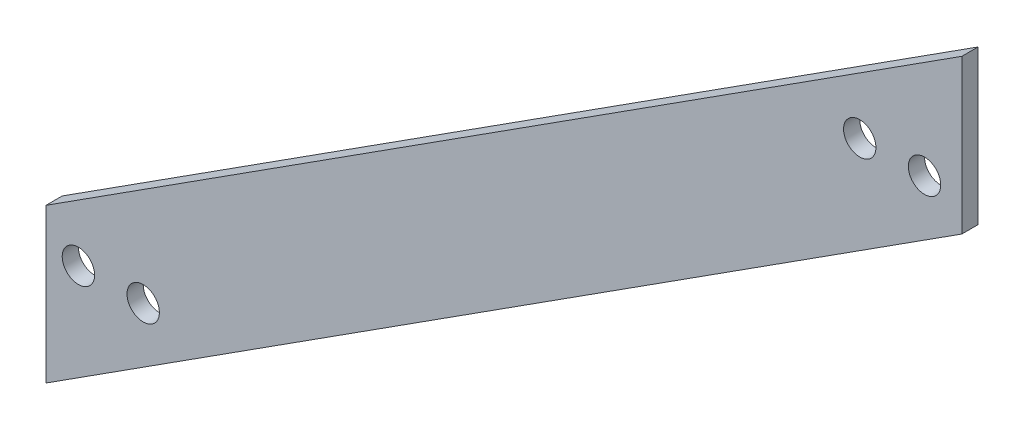
ISO-10303-21;
HEADER;
FILE_DESCRIPTION(('STEP AP214'),'2;1');
FILE_NAME('part.step','',(''),(''),'','','');
FILE_SCHEMA(('AUTOMOTIVE_DESIGN { 1 0 10303 214 1 1 1 1 }'));
ENDSEC;
DATA;
#1=APPLICATION_CONTEXT('core data for automotive mechanical design processes');
#2=APPLICATION_PROTOCOL_DEFINITION('international standard','automotive_design',2000,#1);
#3=PRODUCT_CONTEXT('',#1,'mechanical');
#4=PRODUCT('Part','Part','',(#3));
#5=PRODUCT_RELATED_PRODUCT_CATEGORY('part','',(#4));
#6=PRODUCT_DEFINITION_FORMATION('','',#4);
#7=PRODUCT_DEFINITION_CONTEXT('part definition',#1,'design');
#8=PRODUCT_DEFINITION('design','',#6,#7);
#9=PRODUCT_DEFINITION_SHAPE('','',#8);
#10=(LENGTH_UNIT() NAMED_UNIT(*) SI_UNIT(.MILLI.,.METRE.));
#11=(NAMED_UNIT(*) PLANE_ANGLE_UNIT() SI_UNIT($,.RADIAN.));
#12=(NAMED_UNIT(*) SI_UNIT($,.STERADIAN.) SOLID_ANGLE_UNIT());
#13=UNCERTAINTY_MEASURE_WITH_UNIT(LENGTH_MEASURE(1.E-05),#10,'distance_accuracy_value','');
#14=(GEOMETRIC_REPRESENTATION_CONTEXT(3) GLOBAL_UNCERTAINTY_ASSIGNED_CONTEXT((#13)) GLOBAL_UNIT_ASSIGNED_CONTEXT((#10,
#11,#12)) REPRESENTATION_CONTEXT('',''));
#15=CARTESIAN_POINT('',(0.,0.,0.));
#16=DIRECTION('',(0.,0.,1.));
#17=DIRECTION('',(1.,0.,0.));
#18=AXIS2_PLACEMENT_3D('',#15,#16,#17);
#19=CARTESIAN_POINT('',(0.,0.,4.7625));
#20=DIRECTION('',(0.,0.,1.));
#21=DIRECTION('',(1.,0.,0.));
#22=AXIS2_PLACEMENT_3D('',#19,#20,#21);
#23=PLANE('',#22);
#24=CARTESIAN_POINT('',(239.234787133526,136.66818134882,4.7625));
#25=DIRECTION('',(0.,0.,1.));
#26=DIRECTION('',(1.,0.,0.));
#27=AXIS2_PLACEMENT_3D('',#24,#25,#26);
#28=CIRCLE('',#27,4.76250000000001);
#29=CARTESIAN_POINT('',(234.472287133526,136.66818134882,4.7625));
#30=VERTEX_POINT('',#29);
#31=EDGE_CURVE('E129',#30,#30,#28,.T.);
#32=ORIENTED_EDGE('',*,*,#31,.F.);
#33=EDGE_LOOP('',(#32));
#34=FACE_BOUND('',#33,.T.);
#35=CARTESIAN_POINT('',(9.525,-10.6518186511802,4.7625));
#36=DIRECTION('',(0.,0.,1.));
#37=DIRECTION('',(1.,0.,0.));
#38=AXIS2_PLACEMENT_3D('',#35,#36,#37);
#39=CIRCLE('',#38,4.76250000000001);
#40=CARTESIAN_POINT('',(4.76249999999999,-10.6518186511802,4.7625));
#41=VERTEX_POINT('',#40);
#42=EDGE_CURVE('E108',#41,#41,#39,.T.);
#43=ORIENTED_EDGE('',*,*,#42,.F.);
#44=EDGE_LOOP('',(#43));
#45=FACE_BOUND('',#44,.T.);
#46=DIRECTION('',(-0.841938046068308,-0.53957420859663,0.));
#47=VECTOR('',#46,1.);
#48=CARTESIAN_POINT('',(269.24,172.548277870282,4.7625));
#49=LINE('',#48,#47);
#50=CARTESIAN_POINT('',(269.24,172.548277870282,4.7625));
#51=VERTEX_POINT('',#50);
#52=CARTESIAN_POINT('',(0.,0.,4.7625));
#53=VERTEX_POINT('',#52);
#54=EDGE_CURVE('E93',#51,#53,#49,.T.);
#55=ORIENTED_EDGE('',*,*,#54,.T.);
#56=DIRECTION('',(0.,-1.,0.));
#57=VECTOR('',#56,1.);
#58=CARTESIAN_POINT('',(0.,0.,4.7625));
#59=LINE('',#58,#57);
#60=CARTESIAN_POINT('',(0.,-45.2527358490541,4.7625));
#61=VERTEX_POINT('',#60);
#62=EDGE_CURVE('E88',#53,#61,#59,.T.);
#63=ORIENTED_EDGE('',*,*,#62,.T.);
#64=DIRECTION('',(0.841938046068308,0.539574208596631,0.));
#65=VECTOR('',#64,1.);
#66=CARTESIAN_POINT('',(0.,-45.2527358490541,4.7625));
#67=LINE('',#66,#65);
#68=CARTESIAN_POINT('',(269.24,127.295542021228,4.7625));
#69=VERTEX_POINT('',#68);
#70=EDGE_CURVE('E91',#61,#69,#67,.T.);
#71=ORIENTED_EDGE('',*,*,#70,.T.);
#72=DIRECTION('',(0.,1.,0.));
#73=VECTOR('',#72,1.);
#74=CARTESIAN_POINT('',(269.24,127.295542021228,4.7625));
#75=LINE('',#74,#73);
#76=EDGE_CURVE('E58',#69,#51,#75,.T.);
#77=ORIENTED_EDGE('',*,*,#76,.T.);
#78=EDGE_LOOP('',(#55,#63,#71,#77));
#79=FACE_BOUND('',#78,.T.);
#80=CARTESIAN_POINT('',(28.575,-10.6518186511802,4.7625));
#81=DIRECTION('',(0.,0.,1.));
#82=DIRECTION('',(1.,0.,0.));
#83=AXIS2_PLACEMENT_3D('',#80,#81,#82);
#84=CIRCLE('',#83,4.76250000000001);
#85=CARTESIAN_POINT('',(23.8125,-10.6518186511802,4.7625));
#86=VERTEX_POINT('',#85);
#87=EDGE_CURVE('E123',#86,#86,#84,.T.);
#88=ORIENTED_EDGE('',*,*,#87,.F.);
#89=EDGE_LOOP('',(#88));
#90=FACE_BOUND('',#89,.T.);
#91=CARTESIAN_POINT('',(258.284787133526,136.66818134882,4.7625));
#92=DIRECTION('',(0.,0.,1.));
#93=DIRECTION('',(1.,0.,0.));
#94=AXIS2_PLACEMENT_3D('',#91,#92,#93);
#95=CIRCLE('',#94,4.76250000000001);
#96=CARTESIAN_POINT('',(253.522287133526,136.66818134882,4.7625));
#97=VERTEX_POINT('',#96);
#98=EDGE_CURVE('E135',#97,#97,#95,.T.);
#99=ORIENTED_EDGE('',*,*,#98,.F.);
#100=EDGE_LOOP('',(#99));
#101=FACE_BOUND('',#100,.T.);
#102=ADVANCED_FACE('F41',(#34,#45,#79,#90,#101),#23,.T.);
#103=CARTESIAN_POINT('',(0.,0.,0.));
#104=DIRECTION('',(0.,0.,1.));
#105=DIRECTION('',(1.,0.,0.));
#106=AXIS2_PLACEMENT_3D('',#103,#104,#105);
#107=PLANE('',#106);
#108=DIRECTION('',(-0.841938046068308,-0.53957420859663,0.));
#109=VECTOR('',#108,1.);
#110=CARTESIAN_POINT('',(269.24,172.548277870282,0.));
#111=LINE('',#110,#109);
#112=CARTESIAN_POINT('',(269.24,172.548277870282,0.));
#113=VERTEX_POINT('',#112);
#114=CARTESIAN_POINT('',(0.,0.,0.));
#115=VERTEX_POINT('',#114);
#116=EDGE_CURVE('E105',#113,#115,#111,.T.);
#117=ORIENTED_EDGE('',*,*,#116,.F.);
#118=DIRECTION('',(0.,1.,0.));
#119=VECTOR('',#118,1.);
#120=CARTESIAN_POINT('',(269.24,127.295542021228,0.));
#121=LINE('',#120,#119);
#122=CARTESIAN_POINT('',(269.24,127.295542021228,0.));
#123=VERTEX_POINT('',#122);
#124=EDGE_CURVE('E81',#123,#113,#121,.T.);
#125=ORIENTED_EDGE('',*,*,#124,.F.);
#126=DIRECTION('',(0.841938046068308,0.539574208596631,0.));
#127=VECTOR('',#126,1.);
#128=CARTESIAN_POINT('',(0.,-45.2527358490541,0.));
#129=LINE('',#128,#127);
#130=CARTESIAN_POINT('',(0.,-45.2527358490541,0.));
#131=VERTEX_POINT('',#130);
#132=EDGE_CURVE('E75',#131,#123,#129,.T.);
#133=ORIENTED_EDGE('',*,*,#132,.F.);
#134=DIRECTION('',(0.,-1.,0.));
#135=VECTOR('',#134,1.);
#136=CARTESIAN_POINT('',(0.,0.,0.));
#137=LINE('',#136,#135);
#138=EDGE_CURVE('E97',#115,#131,#137,.T.);
#139=ORIENTED_EDGE('',*,*,#138,.F.);
#140=EDGE_LOOP('',(#117,#125,#133,#139));
#141=FACE_BOUND('',#140,.T.);
#142=CARTESIAN_POINT('',(9.525,-10.6518186511802,0.));
#143=DIRECTION('',(0.,0.,1.));
#144=DIRECTION('',(1.,0.,0.));
#145=AXIS2_PLACEMENT_3D('',#142,#143,#144);
#146=CIRCLE('',#145,4.76250000000001);
#147=CARTESIAN_POINT('',(4.76249999999999,-10.6518186511802,0.));
#148=VERTEX_POINT('',#147);
#149=EDGE_CURVE('E120',#148,#148,#146,.T.);
#150=ORIENTED_EDGE('',*,*,#149,.T.);
#151=EDGE_LOOP('',(#150));
#152=FACE_BOUND('',#151,.T.);
#153=CARTESIAN_POINT('',(28.575,-10.6518186511802,0.));
#154=DIRECTION('',(0.,0.,1.));
#155=DIRECTION('',(1.,0.,0.));
#156=AXIS2_PLACEMENT_3D('',#153,#154,#155);
#157=CIRCLE('',#156,4.76250000000001);
#158=CARTESIAN_POINT('',(23.8125,-10.6518186511802,0.));
#159=VERTEX_POINT('',#158);
#160=EDGE_CURVE('E126',#159,#159,#157,.T.);
#161=ORIENTED_EDGE('',*,*,#160,.T.);
#162=EDGE_LOOP('',(#161));
#163=FACE_BOUND('',#162,.T.);
#164=CARTESIAN_POINT('',(239.234787133526,136.66818134882,0.));
#165=DIRECTION('',(0.,0.,1.));
#166=DIRECTION('',(1.,0.,0.));
#167=AXIS2_PLACEMENT_3D('',#164,#165,#166);
#168=CIRCLE('',#167,4.76250000000001);
#169=CARTESIAN_POINT('',(234.472287133526,136.66818134882,0.));
#170=VERTEX_POINT('',#169);
#171=EDGE_CURVE('E132',#170,#170,#168,.T.);
#172=ORIENTED_EDGE('',*,*,#171,.T.);
#173=EDGE_LOOP('',(#172));
#174=FACE_BOUND('',#173,.T.);
#175=CARTESIAN_POINT('',(258.284787133526,136.66818134882,0.));
#176=DIRECTION('',(0.,0.,1.));
#177=DIRECTION('',(1.,0.,0.));
#178=AXIS2_PLACEMENT_3D('',#175,#176,#177);
#179=CIRCLE('',#178,4.76250000000001);
#180=CARTESIAN_POINT('',(253.522287133526,136.66818134882,0.));
#181=VERTEX_POINT('',#180);
#182=EDGE_CURVE('E138',#181,#181,#179,.T.);
#183=ORIENTED_EDGE('',*,*,#182,.T.);
#184=EDGE_LOOP('',(#183));
#185=FACE_BOUND('',#184,.T.);
#186=ADVANCED_FACE('F116',(#141,#152,#163,#174,#185),#107,.F.);
#187=CARTESIAN_POINT('',(269.24,172.548277870282,4.7625));
#188=DIRECTION('',(0.53957420859663,-0.841938046068308,0.));
#189=DIRECTION('',(0.841938046068308,0.53957420859663,0.));
#190=AXIS2_PLACEMENT_3D('',#187,#188,#189);
#191=PLANE('',#190);
#192=ORIENTED_EDGE('',*,*,#116,.T.);
#193=DIRECTION('',(0.,0.,-1.));
#194=VECTOR('',#193,1.);
#195=CARTESIAN_POINT('',(0.,0.,4.7625));
#196=LINE('',#195,#194);
#197=EDGE_CURVE('E11',#53,#115,#196,.T.);
#198=ORIENTED_EDGE('',*,*,#197,.F.);
#199=ORIENTED_EDGE('',*,*,#54,.F.);
#200=DIRECTION('',(0.,0.,-1.));
#201=VECTOR('',#200,1.);
#202=CARTESIAN_POINT('',(269.24,172.548277870282,4.7625));
#203=LINE('',#202,#201);
#204=EDGE_CURVE('E101',#51,#113,#203,.T.);
#205=ORIENTED_EDGE('',*,*,#204,.T.);
#206=EDGE_LOOP('',(#192,#198,#199,#205));
#207=FACE_BOUND('',#206,.T.);
#208=ADVANCED_FACE('F43',(#207),#191,.F.);
#209=CARTESIAN_POINT('',(0.,0.,4.7625));
#210=DIRECTION('',(1.,0.,0.));
#211=DIRECTION('',(0.,1.,0.));
#212=AXIS2_PLACEMENT_3D('',#209,#210,#211);
#213=PLANE('',#212);
#214=ORIENTED_EDGE('',*,*,#138,.T.);
#215=DIRECTION('',(0.,0.,-1.));
#216=VECTOR('',#215,1.);
#217=CARTESIAN_POINT('',(0.,-45.2527358490541,4.7625));
#218=LINE('',#217,#216);
#219=EDGE_CURVE('E50',#61,#131,#218,.T.);
#220=ORIENTED_EDGE('',*,*,#219,.F.);
#221=ORIENTED_EDGE('',*,*,#62,.F.);
#222=ORIENTED_EDGE('',*,*,#197,.T.);
#223=EDGE_LOOP('',(#214,#220,#221,#222));
#224=FACE_BOUND('',#223,.T.);
#225=ADVANCED_FACE('F96',(#224),#213,.F.);
#226=CARTESIAN_POINT('',(0.,-45.2527358490541,4.7625));
#227=DIRECTION('',(-0.539574208596631,0.841938046068308,0.));
#228=DIRECTION('',(-0.841938046068308,-0.539574208596631,0.));
#229=AXIS2_PLACEMENT_3D('',#226,#227,#228);
#230=PLANE('',#229);
#231=ORIENTED_EDGE('',*,*,#132,.T.);
#232=DIRECTION('',(0.,0.,-1.));
#233=VECTOR('',#232,1.);
#234=CARTESIAN_POINT('',(269.24,127.295542021228,4.7625));
#235=LINE('',#234,#233);
#236=EDGE_CURVE('E98',#69,#123,#235,.T.);
#237=ORIENTED_EDGE('',*,*,#236,.F.);
#238=ORIENTED_EDGE('',*,*,#70,.F.);
#239=ORIENTED_EDGE('',*,*,#219,.T.);
#240=EDGE_LOOP('',(#231,#237,#238,#239));
#241=FACE_BOUND('',#240,.T.);
#242=ADVANCED_FACE('F99',(#241),#230,.F.);
#243=CARTESIAN_POINT('',(269.24,127.295542021228,4.7625));
#244=DIRECTION('',(-1.,0.,0.));
#245=DIRECTION('',(0.,0.,1.));
#246=AXIS2_PLACEMENT_3D('',#243,#244,#245);
#247=PLANE('',#246);
#248=ORIENTED_EDGE('',*,*,#124,.T.);
#249=ORIENTED_EDGE('',*,*,#204,.F.);
#250=ORIENTED_EDGE('',*,*,#76,.F.);
#251=ORIENTED_EDGE('',*,*,#236,.T.);
#252=EDGE_LOOP('',(#248,#249,#250,#251));
#253=FACE_BOUND('',#252,.T.);
#254=ADVANCED_FACE('F113',(#253),#247,.F.);
#255=CARTESIAN_POINT('',(9.525,-10.6518186511802,4.7625));
#256=DIRECTION('',(0.,0.,-1.));
#257=DIRECTION('',(-1.,0.,0.));
#258=AXIS2_PLACEMENT_3D('',#255,#256,#257);
#259=CYLINDRICAL_SURFACE('',#258,4.76250000000001);
#260=CARTESIAN_POINT('',(4.76249999999999,-10.6518186511802,4.7625));
#261=CARTESIAN_POINT('',(4.76249999999999,-10.6518186511802,4.712890625));
#262=CARTESIAN_POINT('',(4.76249999999999,-10.6518186511802,4.66328125));
#263=CARTESIAN_POINT('',(4.76249999999999,-10.6518186511802,4.5640625));
#264=CARTESIAN_POINT('',(4.76249999999999,-10.6518186511802,4.514453125));
#265=CARTESIAN_POINT('',(4.76249999999999,-10.6518186511802,4.415234375));
#266=CARTESIAN_POINT('',(4.76249999999999,-10.6518186511802,4.365625));
#267=CARTESIAN_POINT('',(4.76249999999999,-10.6518186511802,4.26640625));
#268=CARTESIAN_POINT('',(4.76249999999999,-10.6518186511802,4.216796875));
#269=CARTESIAN_POINT('',(4.76249999999999,-10.6518186511802,4.117578125));
#270=CARTESIAN_POINT('',(4.76249999999999,-10.6518186511802,4.06796875));
#271=CARTESIAN_POINT('',(4.76249999999999,-10.6518186511802,3.96875));
#272=CARTESIAN_POINT('',(4.76249999999999,-10.6518186511802,3.919140625));
#273=CARTESIAN_POINT('',(4.76249999999999,-10.6518186511802,3.819921875));
#274=CARTESIAN_POINT('',(4.76249999999999,-10.6518186511802,3.7703125));
#275=CARTESIAN_POINT('',(4.76249999999999,-10.6518186511802,3.67109375));
#276=CARTESIAN_POINT('',(4.76249999999999,-10.6518186511802,3.621484375));
#277=CARTESIAN_POINT('',(4.76249999999999,-10.6518186511802,3.522265625));
#278=CARTESIAN_POINT('',(4.76249999999999,-10.6518186511802,3.47265625));
#279=CARTESIAN_POINT('',(4.76249999999999,-10.6518186511802,3.3734375));
#280=CARTESIAN_POINT('',(4.76249999999999,-10.6518186511802,3.323828125));
#281=CARTESIAN_POINT('',(4.76249999999999,-10.6518186511802,3.224609375));
#282=CARTESIAN_POINT('',(4.76249999999999,-10.6518186511802,3.175));
#283=CARTESIAN_POINT('',(4.76249999999999,-10.6518186511802,3.07578125));
#284=CARTESIAN_POINT('',(4.76249999999999,-10.6518186511802,3.026171875));
#285=CARTESIAN_POINT('',(4.76249999999999,-10.6518186511802,2.926953125));
#286=CARTESIAN_POINT('',(4.76249999999999,-10.6518186511802,2.87734375));
#287=CARTESIAN_POINT('',(4.76249999999999,-10.6518186511802,2.778125));
#288=CARTESIAN_POINT('',(4.76249999999999,-10.6518186511802,2.728515625));
#289=CARTESIAN_POINT('',(4.76249999999999,-10.6518186511802,2.629296875));
#290=CARTESIAN_POINT('',(4.76249999999999,-10.6518186511802,2.5796875));
#291=CARTESIAN_POINT('',(4.76249999999999,-10.6518186511802,2.48046875));
#292=CARTESIAN_POINT('',(4.76249999999999,-10.6518186511802,2.430859375));
#293=CARTESIAN_POINT('',(4.76249999999999,-10.6518186511802,2.331640625));
#294=CARTESIAN_POINT('',(4.76249999999999,-10.6518186511802,2.28203125));
#295=CARTESIAN_POINT('',(4.76249999999999,-10.6518186511802,2.1828125));
#296=CARTESIAN_POINT('',(4.76249999999999,-10.6518186511802,2.133203125));
#297=CARTESIAN_POINT('',(4.76249999999999,-10.6518186511802,2.033984375));
#298=CARTESIAN_POINT('',(4.76249999999999,-10.6518186511802,1.984375));
#299=CARTESIAN_POINT('',(4.76249999999999,-10.6518186511802,1.88515625));
#300=CARTESIAN_POINT('',(4.76249999999999,-10.6518186511802,1.835546875));
#301=CARTESIAN_POINT('',(4.76249999999999,-10.6518186511802,1.736328125));
#302=CARTESIAN_POINT('',(4.76249999999999,-10.6518186511802,1.68671875));
#303=CARTESIAN_POINT('',(4.76249999999999,-10.6518186511802,1.5875));
#304=CARTESIAN_POINT('',(4.76249999999999,-10.6518186511802,1.537890625));
#305=CARTESIAN_POINT('',(4.76249999999999,-10.6518186511802,1.438671875));
#306=CARTESIAN_POINT('',(4.76249999999999,-10.6518186511802,1.3890625));
#307=CARTESIAN_POINT('',(4.76249999999999,-10.6518186511802,1.28984375));
#308=CARTESIAN_POINT('',(4.76249999999999,-10.6518186511802,1.240234375));
#309=CARTESIAN_POINT('',(4.76249999999999,-10.6518186511802,1.141015625));
#310=CARTESIAN_POINT('',(4.76249999999999,-10.6518186511802,1.09140625));
#311=CARTESIAN_POINT('',(4.76249999999999,-10.6518186511802,0.992187499999999));
#312=CARTESIAN_POINT('',(4.76249999999999,-10.6518186511802,0.942578124999999));
#313=CARTESIAN_POINT('',(4.76249999999999,-10.6518186511802,0.843359375));
#314=CARTESIAN_POINT('',(4.76249999999999,-10.6518186511802,0.79375));
#315=CARTESIAN_POINT('',(4.76249999999999,-10.6518186511802,0.69453125));
#316=CARTESIAN_POINT('',(4.76249999999999,-10.6518186511802,0.644921875));
#317=CARTESIAN_POINT('',(4.76249999999999,-10.6518186511802,0.545703125));
#318=CARTESIAN_POINT('',(4.76249999999999,-10.6518186511802,0.49609375));
#319=CARTESIAN_POINT('',(4.76249999999999,-10.6518186511802,0.396875));
#320=CARTESIAN_POINT('',(4.76249999999999,-10.6518186511802,0.347265625));
#321=CARTESIAN_POINT('',(4.76249999999999,-10.6518186511802,0.248046875));
#322=CARTESIAN_POINT('',(4.76249999999999,-10.6518186511802,0.1984375));
#323=CARTESIAN_POINT('',(4.76249999999999,-10.6518186511802,0.09921875));
#324=CARTESIAN_POINT('',(4.76249999999999,-10.6518186511802,0.049609375));
#325=CARTESIAN_POINT('',(4.76249999999999,-10.6518186511802,0.));
#326=B_SPLINE_CURVE_WITH_KNOTS('',3,(#260,#261,#262,#263,#264,#265,#266,#267,#268,#269,#270,
#271,#272,#273,#274,#275,#276,#277,#278,#279,#280,#281,#282,#283,#284,#285,#286,#287,#288,#289,
#290,#291,#292,#293,#294,#295,#296,#297,#298,#299,#300,#301,#302,#303,#304,#305,#306,#307,#308,
#309,#310,#311,#312,#313,#314,#315,#316,#317,#318,#319,#320,#321,#322,#323,#324,#325),
.UNSPECIFIED.,.F.,.F.,(4,2,2,2,2,2,2,2,2,2,2,2,2,2,2,2,2,2,2,2,2,2,2,2,2,2,2,2,2,2,2,2,4),(0.,
0.148828125,0.29765625,0.446484375,0.5953125,0.744140625,0.892968750000001,1.041796875,1.190625,
1.339453125,1.48828125,1.637109375,1.7859375,1.934765625,2.08359375,2.232421875,2.38125,
2.530078125,2.67890625,2.827734375,2.9765625,3.125390625,3.27421875,3.423046875,3.571875,
3.720703125,3.86953125,4.018359375,4.1671875,4.316015625,4.46484375,4.613671875,4.7625),.UNSPECIFIED.);
#327=EDGE_CURVE('BSEAM157',#41,#148,#326,.T.);
#328=ORIENTED_EDGE('',*,*,#42,.T.);
#329=ORIENTED_EDGE('',*,*,#149,.F.);
#330=ORIENTED_EDGE('',*,*,#327,.T.);
#331=ORIENTED_EDGE('',*,*,#327,.F.);
#332=EDGE_LOOP('',(#328,#330,#329,#331));
#333=FACE_BOUND('',#332,.T.);
#334=ADVANCED_FACE('F157',(#333),#259,.F.);
#335=CARTESIAN_POINT('',(28.575,-10.6518186511802,4.7625));
#336=DIRECTION('',(0.,0.,-1.));
#337=DIRECTION('',(-1.,0.,0.));
#338=AXIS2_PLACEMENT_3D('',#335,#336,#337);
#339=CYLINDRICAL_SURFACE('',#338,4.76250000000001);
#340=CARTESIAN_POINT('',(23.8125,-10.6518186511802,4.7625));
#341=CARTESIAN_POINT('',(23.8125,-10.6518186511802,4.712890625));
#342=CARTESIAN_POINT('',(23.8125,-10.6518186511802,4.66328125));
#343=CARTESIAN_POINT('',(23.8125,-10.6518186511802,4.5640625));
#344=CARTESIAN_POINT('',(23.8125,-10.6518186511802,4.514453125));
#345=CARTESIAN_POINT('',(23.8125,-10.6518186511802,4.415234375));
#346=CARTESIAN_POINT('',(23.8125,-10.6518186511802,4.365625));
#347=CARTESIAN_POINT('',(23.8125,-10.6518186511802,4.26640625));
#348=CARTESIAN_POINT('',(23.8125,-10.6518186511802,4.216796875));
#349=CARTESIAN_POINT('',(23.8125,-10.6518186511802,4.117578125));
#350=CARTESIAN_POINT('',(23.8125,-10.6518186511802,4.06796875));
#351=CARTESIAN_POINT('',(23.8125,-10.6518186511802,3.96875));
#352=CARTESIAN_POINT('',(23.8125,-10.6518186511802,3.919140625));
#353=CARTESIAN_POINT('',(23.8125,-10.6518186511802,3.819921875));
#354=CARTESIAN_POINT('',(23.8125,-10.6518186511802,3.7703125));
#355=CARTESIAN_POINT('',(23.8125,-10.6518186511802,3.67109375));
#356=CARTESIAN_POINT('',(23.8125,-10.6518186511802,3.621484375));
#357=CARTESIAN_POINT('',(23.8125,-10.6518186511802,3.522265625));
#358=CARTESIAN_POINT('',(23.8125,-10.6518186511802,3.47265625));
#359=CARTESIAN_POINT('',(23.8125,-10.6518186511802,3.3734375));
#360=CARTESIAN_POINT('',(23.8125,-10.6518186511802,3.323828125));
#361=CARTESIAN_POINT('',(23.8125,-10.6518186511802,3.224609375));
#362=CARTESIAN_POINT('',(23.8125,-10.6518186511802,3.175));
#363=CARTESIAN_POINT('',(23.8125,-10.6518186511802,3.07578125));
#364=CARTESIAN_POINT('',(23.8125,-10.6518186511802,3.026171875));
#365=CARTESIAN_POINT('',(23.8125,-10.6518186511802,2.926953125));
#366=CARTESIAN_POINT('',(23.8125,-10.6518186511802,2.87734375));
#367=CARTESIAN_POINT('',(23.8125,-10.6518186511802,2.778125));
#368=CARTESIAN_POINT('',(23.8125,-10.6518186511802,2.728515625));
#369=CARTESIAN_POINT('',(23.8125,-10.6518186511802,2.629296875));
#370=CARTESIAN_POINT('',(23.8125,-10.6518186511802,2.5796875));
#371=CARTESIAN_POINT('',(23.8125,-10.6518186511802,2.48046875));
#372=CARTESIAN_POINT('',(23.8125,-10.6518186511802,2.430859375));
#373=CARTESIAN_POINT('',(23.8125,-10.6518186511802,2.331640625));
#374=CARTESIAN_POINT('',(23.8125,-10.6518186511802,2.28203125));
#375=CARTESIAN_POINT('',(23.8125,-10.6518186511802,2.1828125));
#376=CARTESIAN_POINT('',(23.8125,-10.6518186511802,2.133203125));
#377=CARTESIAN_POINT('',(23.8125,-10.6518186511802,2.033984375));
#378=CARTESIAN_POINT('',(23.8125,-10.6518186511802,1.984375));
#379=CARTESIAN_POINT('',(23.8125,-10.6518186511802,1.88515625));
#380=CARTESIAN_POINT('',(23.8125,-10.6518186511802,1.835546875));
#381=CARTESIAN_POINT('',(23.8125,-10.6518186511802,1.736328125));
#382=CARTESIAN_POINT('',(23.8125,-10.6518186511802,1.68671875));
#383=CARTESIAN_POINT('',(23.8125,-10.6518186511802,1.5875));
#384=CARTESIAN_POINT('',(23.8125,-10.6518186511802,1.537890625));
#385=CARTESIAN_POINT('',(23.8125,-10.6518186511802,1.438671875));
#386=CARTESIAN_POINT('',(23.8125,-10.6518186511802,1.3890625));
#387=CARTESIAN_POINT('',(23.8125,-10.6518186511802,1.28984375));
#388=CARTESIAN_POINT('',(23.8125,-10.6518186511802,1.240234375));
#389=CARTESIAN_POINT('',(23.8125,-10.6518186511802,1.141015625));
#390=CARTESIAN_POINT('',(23.8125,-10.6518186511802,1.09140625));
#391=CARTESIAN_POINT('',(23.8125,-10.6518186511802,0.992187499999999));
#392=CARTESIAN_POINT('',(23.8125,-10.6518186511802,0.942578124999999));
#393=CARTESIAN_POINT('',(23.8125,-10.6518186511802,0.843359375));
#394=CARTESIAN_POINT('',(23.8125,-10.6518186511802,0.79375));
#395=CARTESIAN_POINT('',(23.8125,-10.6518186511802,0.69453125));
#396=CARTESIAN_POINT('',(23.8125,-10.6518186511802,0.644921875));
#397=CARTESIAN_POINT('',(23.8125,-10.6518186511802,0.545703125));
#398=CARTESIAN_POINT('',(23.8125,-10.6518186511802,0.49609375));
#399=CARTESIAN_POINT('',(23.8125,-10.6518186511802,0.396875));
#400=CARTESIAN_POINT('',(23.8125,-10.6518186511802,0.347265625));
#401=CARTESIAN_POINT('',(23.8125,-10.6518186511802,0.248046875));
#402=CARTESIAN_POINT('',(23.8125,-10.6518186511802,0.1984375));
#403=CARTESIAN_POINT('',(23.8125,-10.6518186511802,0.09921875));
#404=CARTESIAN_POINT('',(23.8125,-10.6518186511802,0.049609375));
#405=CARTESIAN_POINT('',(23.8125,-10.6518186511802,0.));
#406=B_SPLINE_CURVE_WITH_KNOTS('',3,(#340,#341,#342,#343,#344,#345,#346,#347,#348,#349,#350,
#351,#352,#353,#354,#355,#356,#357,#358,#359,#360,#361,#362,#363,#364,#365,#366,#367,#368,#369,
#370,#371,#372,#373,#374,#375,#376,#377,#378,#379,#380,#381,#382,#383,#384,#385,#386,#387,#388,
#389,#390,#391,#392,#393,#394,#395,#396,#397,#398,#399,#400,#401,#402,#403,#404,#405),
.UNSPECIFIED.,.F.,.F.,(4,2,2,2,2,2,2,2,2,2,2,2,2,2,2,2,2,2,2,2,2,2,2,2,2,2,2,2,2,2,2,2,4),(0.,
0.148828125,0.29765625,0.446484375,0.5953125,0.744140625,0.892968750000001,1.041796875,1.190625,
1.339453125,1.48828125,1.637109375,1.7859375,1.934765625,2.08359375,2.232421875,2.38125,
2.530078125,2.67890625,2.827734375,2.9765625,3.125390625,3.27421875,3.423046875,3.571875,
3.720703125,3.86953125,4.018359375,4.1671875,4.316015625,4.46484375,4.613671875,4.7625),.UNSPECIFIED.);
#407=EDGE_CURVE('BSEAM211',#86,#159,#406,.T.);
#408=ORIENTED_EDGE('',*,*,#87,.T.);
#409=ORIENTED_EDGE('',*,*,#160,.F.);
#410=ORIENTED_EDGE('',*,*,#407,.T.);
#411=ORIENTED_EDGE('',*,*,#407,.F.);
#412=EDGE_LOOP('',(#408,#410,#409,#411));
#413=FACE_BOUND('',#412,.T.);
#414=ADVANCED_FACE('F211',(#413),#339,.F.);
#415=CARTESIAN_POINT('',(239.234787133526,136.66818134882,4.7625));
#416=DIRECTION('',(0.,0.,-1.));
#417=DIRECTION('',(-1.,0.,0.));
#418=AXIS2_PLACEMENT_3D('',#415,#416,#417);
#419=CYLINDRICAL_SURFACE('',#418,4.76250000000001);
#420=CARTESIAN_POINT('',(234.472287133526,136.66818134882,4.7625));
#421=CARTESIAN_POINT('',(234.472287133526,136.66818134882,4.712890625));
#422=CARTESIAN_POINT('',(234.472287133526,136.66818134882,4.66328125));
#423=CARTESIAN_POINT('',(234.472287133526,136.66818134882,4.5640625));
#424=CARTESIAN_POINT('',(234.472287133526,136.66818134882,4.514453125));
#425=CARTESIAN_POINT('',(234.472287133526,136.66818134882,4.415234375));
#426=CARTESIAN_POINT('',(234.472287133526,136.66818134882,4.365625));
#427=CARTESIAN_POINT('',(234.472287133526,136.66818134882,4.26640625));
#428=CARTESIAN_POINT('',(234.472287133526,136.66818134882,4.216796875));
#429=CARTESIAN_POINT('',(234.472287133526,136.66818134882,4.117578125));
#430=CARTESIAN_POINT('',(234.472287133526,136.66818134882,4.06796875));
#431=CARTESIAN_POINT('',(234.472287133526,136.66818134882,3.96875));
#432=CARTESIAN_POINT('',(234.472287133526,136.66818134882,3.919140625));
#433=CARTESIAN_POINT('',(234.472287133526,136.66818134882,3.819921875));
#434=CARTESIAN_POINT('',(234.472287133526,136.66818134882,3.7703125));
#435=CARTESIAN_POINT('',(234.472287133526,136.66818134882,3.67109375));
#436=CARTESIAN_POINT('',(234.472287133526,136.66818134882,3.621484375));
#437=CARTESIAN_POINT('',(234.472287133526,136.66818134882,3.522265625));
#438=CARTESIAN_POINT('',(234.472287133526,136.66818134882,3.47265625));
#439=CARTESIAN_POINT('',(234.472287133526,136.66818134882,3.3734375));
#440=CARTESIAN_POINT('',(234.472287133526,136.66818134882,3.323828125));
#441=CARTESIAN_POINT('',(234.472287133526,136.66818134882,3.224609375));
#442=CARTESIAN_POINT('',(234.472287133526,136.66818134882,3.175));
#443=CARTESIAN_POINT('',(234.472287133526,136.66818134882,3.07578125));
#444=CARTESIAN_POINT('',(234.472287133526,136.66818134882,3.026171875));
#445=CARTESIAN_POINT('',(234.472287133526,136.66818134882,2.926953125));
#446=CARTESIAN_POINT('',(234.472287133526,136.66818134882,2.87734375));
#447=CARTESIAN_POINT('',(234.472287133526,136.66818134882,2.778125));
#448=CARTESIAN_POINT('',(234.472287133526,136.66818134882,2.728515625));
#449=CARTESIAN_POINT('',(234.472287133526,136.66818134882,2.629296875));
#450=CARTESIAN_POINT('',(234.472287133526,136.66818134882,2.5796875));
#451=CARTESIAN_POINT('',(234.472287133526,136.66818134882,2.48046875));
#452=CARTESIAN_POINT('',(234.472287133526,136.66818134882,2.430859375));
#453=CARTESIAN_POINT('',(234.472287133526,136.66818134882,2.331640625));
#454=CARTESIAN_POINT('',(234.472287133526,136.66818134882,2.28203125));
#455=CARTESIAN_POINT('',(234.472287133526,136.66818134882,2.1828125));
#456=CARTESIAN_POINT('',(234.472287133526,136.66818134882,2.133203125));
#457=CARTESIAN_POINT('',(234.472287133526,136.66818134882,2.033984375));
#458=CARTESIAN_POINT('',(234.472287133526,136.66818134882,1.984375));
#459=CARTESIAN_POINT('',(234.472287133526,136.66818134882,1.88515625));
#460=CARTESIAN_POINT('',(234.472287133526,136.66818134882,1.835546875));
#461=CARTESIAN_POINT('',(234.472287133526,136.66818134882,1.736328125));
#462=CARTESIAN_POINT('',(234.472287133526,136.66818134882,1.68671875));
#463=CARTESIAN_POINT('',(234.472287133526,136.66818134882,1.5875));
#464=CARTESIAN_POINT('',(234.472287133526,136.66818134882,1.537890625));
#465=CARTESIAN_POINT('',(234.472287133526,136.66818134882,1.438671875));
#466=CARTESIAN_POINT('',(234.472287133526,136.66818134882,1.3890625));
#467=CARTESIAN_POINT('',(234.472287133526,136.66818134882,1.28984375));
#468=CARTESIAN_POINT('',(234.472287133526,136.66818134882,1.240234375));
#469=CARTESIAN_POINT('',(234.472287133526,136.66818134882,1.141015625));
#470=CARTESIAN_POINT('',(234.472287133526,136.66818134882,1.09140625));
#471=CARTESIAN_POINT('',(234.472287133526,136.66818134882,0.992187499999999));
#472=CARTESIAN_POINT('',(234.472287133526,136.66818134882,0.942578124999999));
#473=CARTESIAN_POINT('',(234.472287133526,136.66818134882,0.843359375));
#474=CARTESIAN_POINT('',(234.472287133526,136.66818134882,0.79375));
#475=CARTESIAN_POINT('',(234.472287133526,136.66818134882,0.69453125));
#476=CARTESIAN_POINT('',(234.472287133526,136.66818134882,0.644921875));
#477=CARTESIAN_POINT('',(234.472287133526,136.66818134882,0.545703125));
#478=CARTESIAN_POINT('',(234.472287133526,136.66818134882,0.49609375));
#479=CARTESIAN_POINT('',(234.472287133526,136.66818134882,0.396875));
#480=CARTESIAN_POINT('',(234.472287133526,136.66818134882,0.347265625));
#481=CARTESIAN_POINT('',(234.472287133526,136.66818134882,0.248046875));
#482=CARTESIAN_POINT('',(234.472287133526,136.66818134882,0.1984375));
#483=CARTESIAN_POINT('',(234.472287133526,136.66818134882,0.09921875));
#484=CARTESIAN_POINT('',(234.472287133526,136.66818134882,0.049609375));
#485=CARTESIAN_POINT('',(234.472287133526,136.66818134882,0.));
#486=B_SPLINE_CURVE_WITH_KNOTS('',3,(#420,#421,#422,#423,#424,#425,#426,#427,#428,#429,#430,
#431,#432,#433,#434,#435,#436,#437,#438,#439,#440,#441,#442,#443,#444,#445,#446,#447,#448,#449,
#450,#451,#452,#453,#454,#455,#456,#457,#458,#459,#460,#461,#462,#463,#464,#465,#466,#467,#468,
#469,#470,#471,#472,#473,#474,#475,#476,#477,#478,#479,#480,#481,#482,#483,#484,#485),
.UNSPECIFIED.,.F.,.F.,(4,2,2,2,2,2,2,2,2,2,2,2,2,2,2,2,2,2,2,2,2,2,2,2,2,2,2,2,2,2,2,2,4),(0.,
0.148828125,0.29765625,0.446484375,0.5953125,0.744140625,0.892968750000001,1.041796875,1.190625,
1.339453125,1.48828125,1.637109375,1.7859375,1.934765625,2.08359375,2.232421875,2.38125,
2.530078125,2.67890625,2.827734375,2.9765625,3.125390625,3.27421875,3.423046875,3.571875,
3.720703125,3.86953125,4.018359375,4.1671875,4.316015625,4.46484375,4.613671875,4.7625),.UNSPECIFIED.);
#487=EDGE_CURVE('BSEAM220',#30,#170,#486,.T.);
#488=ORIENTED_EDGE('',*,*,#31,.T.);
#489=ORIENTED_EDGE('',*,*,#171,.F.);
#490=ORIENTED_EDGE('',*,*,#487,.T.);
#491=ORIENTED_EDGE('',*,*,#487,.F.);
#492=EDGE_LOOP('',(#488,#490,#489,#491));
#493=FACE_BOUND('',#492,.T.);
#494=ADVANCED_FACE('F220',(#493),#419,.F.);
#495=CARTESIAN_POINT('',(258.284787133526,136.66818134882,4.7625));
#496=DIRECTION('',(0.,0.,-1.));
#497=DIRECTION('',(-1.,0.,0.));
#498=AXIS2_PLACEMENT_3D('',#495,#496,#497);
#499=CYLINDRICAL_SURFACE('',#498,4.76250000000001);
#500=CARTESIAN_POINT('',(253.522287133526,136.66818134882,4.7625));
#501=CARTESIAN_POINT('',(253.522287133526,136.66818134882,4.712890625));
#502=CARTESIAN_POINT('',(253.522287133526,136.66818134882,4.66328125));
#503=CARTESIAN_POINT('',(253.522287133526,136.66818134882,4.5640625));
#504=CARTESIAN_POINT('',(253.522287133526,136.66818134882,4.514453125));
#505=CARTESIAN_POINT('',(253.522287133526,136.66818134882,4.415234375));
#506=CARTESIAN_POINT('',(253.522287133526,136.66818134882,4.365625));
#507=CARTESIAN_POINT('',(253.522287133526,136.66818134882,4.26640625));
#508=CARTESIAN_POINT('',(253.522287133526,136.66818134882,4.216796875));
#509=CARTESIAN_POINT('',(253.522287133526,136.66818134882,4.117578125));
#510=CARTESIAN_POINT('',(253.522287133526,136.66818134882,4.06796875));
#511=CARTESIAN_POINT('',(253.522287133526,136.66818134882,3.96875));
#512=CARTESIAN_POINT('',(253.522287133526,136.66818134882,3.919140625));
#513=CARTESIAN_POINT('',(253.522287133526,136.66818134882,3.819921875));
#514=CARTESIAN_POINT('',(253.522287133526,136.66818134882,3.7703125));
#515=CARTESIAN_POINT('',(253.522287133526,136.66818134882,3.67109375));
#516=CARTESIAN_POINT('',(253.522287133526,136.66818134882,3.621484375));
#517=CARTESIAN_POINT('',(253.522287133526,136.66818134882,3.522265625));
#518=CARTESIAN_POINT('',(253.522287133526,136.66818134882,3.47265625));
#519=CARTESIAN_POINT('',(253.522287133526,136.66818134882,3.3734375));
#520=CARTESIAN_POINT('',(253.522287133526,136.66818134882,3.323828125));
#521=CARTESIAN_POINT('',(253.522287133526,136.66818134882,3.224609375));
#522=CARTESIAN_POINT('',(253.522287133526,136.66818134882,3.175));
#523=CARTESIAN_POINT('',(253.522287133526,136.66818134882,3.07578125));
#524=CARTESIAN_POINT('',(253.522287133526,136.66818134882,3.026171875));
#525=CARTESIAN_POINT('',(253.522287133526,136.66818134882,2.926953125));
#526=CARTESIAN_POINT('',(253.522287133526,136.66818134882,2.87734375));
#527=CARTESIAN_POINT('',(253.522287133526,136.66818134882,2.778125));
#528=CARTESIAN_POINT('',(253.522287133526,136.66818134882,2.728515625));
#529=CARTESIAN_POINT('',(253.522287133526,136.66818134882,2.629296875));
#530=CARTESIAN_POINT('',(253.522287133526,136.66818134882,2.5796875));
#531=CARTESIAN_POINT('',(253.522287133526,136.66818134882,2.48046875));
#532=CARTESIAN_POINT('',(253.522287133526,136.66818134882,2.430859375));
#533=CARTESIAN_POINT('',(253.522287133526,136.66818134882,2.331640625));
#534=CARTESIAN_POINT('',(253.522287133526,136.66818134882,2.28203125));
#535=CARTESIAN_POINT('',(253.522287133526,136.66818134882,2.1828125));
#536=CARTESIAN_POINT('',(253.522287133526,136.66818134882,2.133203125));
#537=CARTESIAN_POINT('',(253.522287133526,136.66818134882,2.033984375));
#538=CARTESIAN_POINT('',(253.522287133526,136.66818134882,1.984375));
#539=CARTESIAN_POINT('',(253.522287133526,136.66818134882,1.88515625));
#540=CARTESIAN_POINT('',(253.522287133526,136.66818134882,1.835546875));
#541=CARTESIAN_POINT('',(253.522287133526,136.66818134882,1.736328125));
#542=CARTESIAN_POINT('',(253.522287133526,136.66818134882,1.68671875));
#543=CARTESIAN_POINT('',(253.522287133526,136.66818134882,1.5875));
#544=CARTESIAN_POINT('',(253.522287133526,136.66818134882,1.537890625));
#545=CARTESIAN_POINT('',(253.522287133526,136.66818134882,1.438671875));
#546=CARTESIAN_POINT('',(253.522287133526,136.66818134882,1.3890625));
#547=CARTESIAN_POINT('',(253.522287133526,136.66818134882,1.28984375));
#548=CARTESIAN_POINT('',(253.522287133526,136.66818134882,1.240234375));
#549=CARTESIAN_POINT('',(253.522287133526,136.66818134882,1.141015625));
#550=CARTESIAN_POINT('',(253.522287133526,136.66818134882,1.09140625));
#551=CARTESIAN_POINT('',(253.522287133526,136.66818134882,0.992187499999999));
#552=CARTESIAN_POINT('',(253.522287133526,136.66818134882,0.942578124999999));
#553=CARTESIAN_POINT('',(253.522287133526,136.66818134882,0.843359375));
#554=CARTESIAN_POINT('',(253.522287133526,136.66818134882,0.79375));
#555=CARTESIAN_POINT('',(253.522287133526,136.66818134882,0.69453125));
#556=CARTESIAN_POINT('',(253.522287133526,136.66818134882,0.644921875));
#557=CARTESIAN_POINT('',(253.522287133526,136.66818134882,0.545703125));
#558=CARTESIAN_POINT('',(253.522287133526,136.66818134882,0.49609375));
#559=CARTESIAN_POINT('',(253.522287133526,136.66818134882,0.396875));
#560=CARTESIAN_POINT('',(253.522287133526,136.66818134882,0.347265625));
#561=CARTESIAN_POINT('',(253.522287133526,136.66818134882,0.248046875));
#562=CARTESIAN_POINT('',(253.522287133526,136.66818134882,0.1984375));
#563=CARTESIAN_POINT('',(253.522287133526,136.66818134882,0.09921875));
#564=CARTESIAN_POINT('',(253.522287133526,136.66818134882,0.049609375));
#565=CARTESIAN_POINT('',(253.522287133526,136.66818134882,0.));
#566=B_SPLINE_CURVE_WITH_KNOTS('',3,(#500,#501,#502,#503,#504,#505,#506,#507,#508,#509,#510,
#511,#512,#513,#514,#515,#516,#517,#518,#519,#520,#521,#522,#523,#524,#525,#526,#527,#528,#529,
#530,#531,#532,#533,#534,#535,#536,#537,#538,#539,#540,#541,#542,#543,#544,#545,#546,#547,#548,
#549,#550,#551,#552,#553,#554,#555,#556,#557,#558,#559,#560,#561,#562,#563,#564,#565),
.UNSPECIFIED.,.F.,.F.,(4,2,2,2,2,2,2,2,2,2,2,2,2,2,2,2,2,2,2,2,2,2,2,2,2,2,2,2,2,2,2,2,4),(0.,
0.148828125,0.29765625,0.446484375,0.5953125,0.744140625,0.892968750000001,1.041796875,1.190625,
1.339453125,1.48828125,1.637109375,1.7859375,1.934765625,2.08359375,2.232421875,2.38125,
2.530078125,2.67890625,2.827734375,2.9765625,3.125390625,3.27421875,3.423046875,3.571875,
3.720703125,3.86953125,4.018359375,4.1671875,4.316015625,4.46484375,4.613671875,4.7625),.UNSPECIFIED.);
#567=EDGE_CURVE('BSEAM144',#97,#181,#566,.T.);
#568=ORIENTED_EDGE('',*,*,#98,.T.);
#569=ORIENTED_EDGE('',*,*,#182,.F.);
#570=ORIENTED_EDGE('',*,*,#567,.T.);
#571=ORIENTED_EDGE('',*,*,#567,.F.);
#572=EDGE_LOOP('',(#568,#570,#569,#571));
#573=FACE_BOUND('',#572,.T.);
#574=ADVANCED_FACE('F144',(#573),#499,.F.);
#575=CLOSED_SHELL('',(#102,#186,#208,#225,#242,#254,#334,#414,#494,#574));
#576=MANIFOLD_SOLID_BREP('B2',#575);
#577=ADVANCED_BREP_SHAPE_REPRESENTATION('',(#18,#576),#14);
#578=SHAPE_DEFINITION_REPRESENTATION(#9,#577);
ENDSEC;
END-ISO-10303-21;
